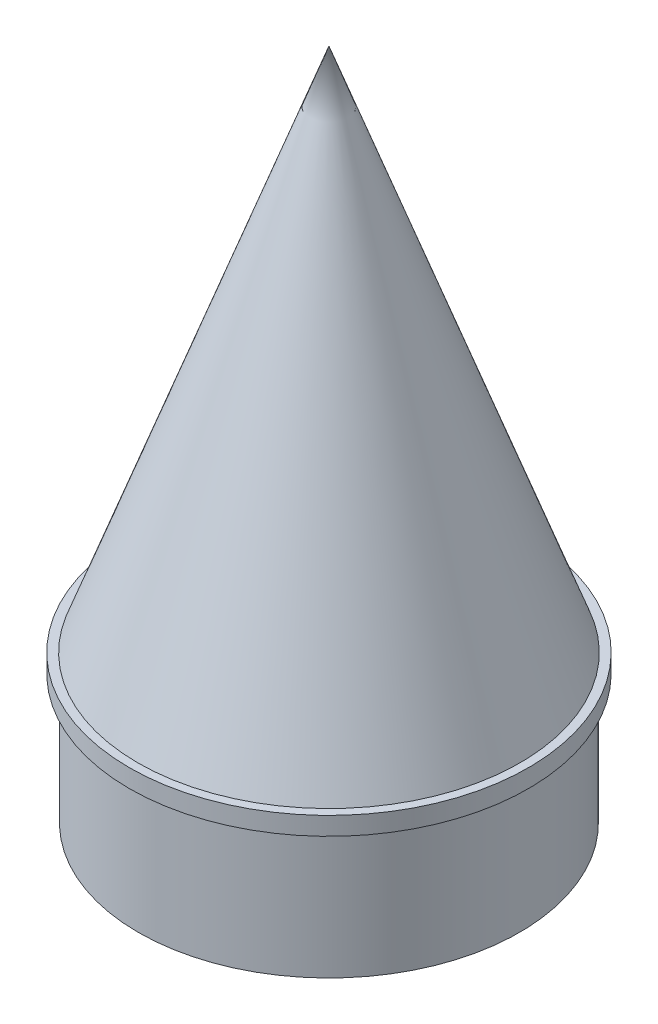
ISO-10303-21;
HEADER;
FILE_DESCRIPTION(('STEP AP214'),'2;1');
FILE_NAME('part.step','',(''),(''),'','','');
FILE_SCHEMA(('AUTOMOTIVE_DESIGN { 1 0 10303 214 1 1 1 1 }'));
ENDSEC;
DATA;
#1=APPLICATION_CONTEXT('core data for automotive mechanical design processes');
#2=APPLICATION_PROTOCOL_DEFINITION('international standard','automotive_design',2000,#1);
#3=PRODUCT_CONTEXT('',#1,'mechanical');
#4=PRODUCT('Part','Part','',(#3));
#5=PRODUCT_RELATED_PRODUCT_CATEGORY('part','',(#4));
#6=PRODUCT_DEFINITION_FORMATION('','',#4);
#7=PRODUCT_DEFINITION_CONTEXT('part definition',#1,'design');
#8=PRODUCT_DEFINITION('design','',#6,#7);
#9=PRODUCT_DEFINITION_SHAPE('','',#8);
#10=(LENGTH_UNIT() NAMED_UNIT(*) SI_UNIT(.MILLI.,.METRE.));
#11=(NAMED_UNIT(*) PLANE_ANGLE_UNIT() SI_UNIT($,.RADIAN.));
#12=(NAMED_UNIT(*) SI_UNIT($,.STERADIAN.) SOLID_ANGLE_UNIT());
#13=UNCERTAINTY_MEASURE_WITH_UNIT(LENGTH_MEASURE(1.E-05),#10,'distance_accuracy_value','');
#14=(GEOMETRIC_REPRESENTATION_CONTEXT(3) GLOBAL_UNCERTAINTY_ASSIGNED_CONTEXT((#13)) GLOBAL_UNIT_ASSIGNED_CONTEXT((#10,
#11,#12)) REPRESENTATION_CONTEXT('',''));
#15=CARTESIAN_POINT('',(0.,0.,0.));
#16=DIRECTION('',(0.,0.,1.));
#17=DIRECTION('',(1.,0.,0.));
#18=AXIS2_PLACEMENT_3D('',#15,#16,#17);
#19=CARTESIAN_POINT('',(0.,0.,0.));
#20=DIRECTION('',(0.,1.,0.));
#21=DIRECTION('',(0.,0.,1.));
#22=AXIS2_PLACEMENT_3D('',#19,#20,#21);
#23=PLANE('',#22);
#24=CARTESIAN_POINT('',(0.,0.,0.));
#25=DIRECTION('',(0.,1.,0.));
#26=DIRECTION('',(0.,0.,1.));
#27=AXIS2_PLACEMENT_3D('',#24,#25,#26);
#28=CIRCLE('',#27,21.1201);
#29=CARTESIAN_POINT('',(0.,0.,21.1201));
#30=VERTEX_POINT('',#29);
#31=EDGE_CURVE('E46',#30,#30,#28,.F.);
#32=ORIENTED_EDGE('',*,*,#31,.T.);
#33=EDGE_LOOP('',(#32));
#34=FACE_BOUND('',#33,.T.);
#35=DIRECTION('',(0.,0.,-1.));
#36=VECTOR('',#35,1.);
#37=CARTESIAN_POINT('',(-5.25,0.,10.25));
#38=LINE('',#37,#36);
#39=CARTESIAN_POINT('',(-5.25,0.,13.25));
#40=VERTEX_POINT('',#39);
#41=CARTESIAN_POINT('',(-5.25,0.,10.25));
#42=VERTEX_POINT('',#41);
#43=EDGE_CURVE('E144',#40,#42,#38,.T.);
#44=ORIENTED_EDGE('',*,*,#43,.F.);
#45=DIRECTION('',(-1.,0.,0.));
#46=VECTOR('',#45,1.);
#47=CARTESIAN_POINT('',(-5.25,0.,13.25));
#48=LINE('',#47,#46);
#49=CARTESIAN_POINT('',(5.25,0.,13.25));
#50=VERTEX_POINT('',#49);
#51=EDGE_CURVE('E165',#50,#40,#48,.T.);
#52=ORIENTED_EDGE('',*,*,#51,.F.);
#53=DIRECTION('',(0.,0.,1.));
#54=VECTOR('',#53,1.);
#55=CARTESIAN_POINT('',(5.25,0.,13.25));
#56=LINE('',#55,#54);
#57=CARTESIAN_POINT('',(5.25,0.,10.25));
#58=VERTEX_POINT('',#57);
#59=EDGE_CURVE('E60',#58,#50,#56,.T.);
#60=ORIENTED_EDGE('',*,*,#59,.F.);
#61=DIRECTION('',(-1.,0.,0.));
#62=VECTOR('',#61,1.);
#63=CARTESIAN_POINT('',(5.25,0.,10.25));
#64=LINE('',#63,#62);
#65=CARTESIAN_POINT('',(16.25,0.,10.25));
#66=VERTEX_POINT('',#65);
#67=EDGE_CURVE('E239',#66,#58,#64,.T.);
#68=ORIENTED_EDGE('',*,*,#67,.F.);
#69=DIRECTION('',(0.,0.,1.));
#70=VECTOR('',#69,1.);
#71=CARTESIAN_POINT('',(16.25,0.,10.25));
#72=LINE('',#71,#70);
#73=CARTESIAN_POINT('',(16.25,0.,-10.25));
#74=VERTEX_POINT('',#73);
#75=EDGE_CURVE('E235',#74,#66,#72,.T.);
#76=ORIENTED_EDGE('',*,*,#75,.F.);
#77=DIRECTION('',(1.,0.,0.));
#78=VECTOR('',#77,1.);
#79=CARTESIAN_POINT('',(16.25,0.,-10.25));
#80=LINE('',#79,#78);
#81=CARTESIAN_POINT('',(5.25,0.,-10.25));
#82=VERTEX_POINT('',#81);
#83=EDGE_CURVE('E231',#82,#74,#80,.T.);
#84=ORIENTED_EDGE('',*,*,#83,.F.);
#85=DIRECTION('',(0.,0.,1.));
#86=VECTOR('',#85,1.);
#87=CARTESIAN_POINT('',(5.25,0.,-10.25));
#88=LINE('',#87,#86);
#89=CARTESIAN_POINT('',(5.25,0.,-13.25));
#90=VERTEX_POINT('',#89);
#91=EDGE_CURVE('E227',#90,#82,#88,.T.);
#92=ORIENTED_EDGE('',*,*,#91,.F.);
#93=DIRECTION('',(1.,0.,0.));
#94=VECTOR('',#93,1.);
#95=CARTESIAN_POINT('',(5.25,0.,-13.25));
#96=LINE('',#95,#94);
#97=CARTESIAN_POINT('',(-5.25,0.,-13.25));
#98=VERTEX_POINT('',#97);
#99=EDGE_CURVE('E223',#98,#90,#96,.T.);
#100=ORIENTED_EDGE('',*,*,#99,.F.);
#101=DIRECTION('',(0.,0.,-1.));
#102=VECTOR('',#101,1.);
#103=CARTESIAN_POINT('',(-5.25,0.,-13.25));
#104=LINE('',#103,#102);
#105=CARTESIAN_POINT('',(-5.25,0.,-10.25));
#106=VERTEX_POINT('',#105);
#107=EDGE_CURVE('E219',#106,#98,#104,.T.);
#108=ORIENTED_EDGE('',*,*,#107,.F.);
#109=DIRECTION('',(1.,0.,0.));
#110=VECTOR('',#109,1.);
#111=CARTESIAN_POINT('',(-5.25,0.,-10.25));
#112=LINE('',#111,#110);
#113=CARTESIAN_POINT('',(-16.25,0.,-10.25));
#114=VERTEX_POINT('',#113);
#115=EDGE_CURVE('E215',#114,#106,#112,.T.);
#116=ORIENTED_EDGE('',*,*,#115,.F.);
#117=DIRECTION('',(0.,0.,-1.));
#118=VECTOR('',#117,1.);
#119=CARTESIAN_POINT('',(-16.25,0.,-10.25));
#120=LINE('',#119,#118);
#121=CARTESIAN_POINT('',(-16.25,0.,10.25));
#122=VERTEX_POINT('',#121);
#123=EDGE_CURVE('E211',#122,#114,#120,.T.);
#124=ORIENTED_EDGE('',*,*,#123,.F.);
#125=DIRECTION('',(-1.,0.,0.));
#126=VECTOR('',#125,1.);
#127=CARTESIAN_POINT('',(-16.25,0.,10.25));
#128=LINE('',#127,#126);
#129=EDGE_CURVE('E208',#42,#122,#128,.T.);
#130=ORIENTED_EDGE('',*,*,#129,.F.);
#131=EDGE_LOOP('',(#44,#52,#60,#68,#76,#84,#92,#100,#108,#116,#124,#130));
#132=FACE_BOUND('',#131,.T.);
#133=ADVANCED_FACE('F42',(#34,#132),#23,.F.);
#134=CARTESIAN_POINT('',(0.,63.5368133879744,0.));
#135=DIRECTION('',(0.,1.,0.));
#136=DIRECTION('',(0.,0.,1.));
#137=AXIS2_PLACEMENT_3D('',#134,#135,#136);
#138=CYLINDRICAL_SURFACE('',#137,21.1201);
#139=CARTESIAN_POINT('',(0.,-15.,0.));
#140=DIRECTION('',(0.,1.,0.));
#141=DIRECTION('',(0.,0.,1.));
#142=AXIS2_PLACEMENT_3D('',#139,#140,#141);
#143=CIRCLE('',#142,21.1201);
#144=CARTESIAN_POINT('',(0.,-15.,21.1201));
#145=VERTEX_POINT('',#144);
#146=EDGE_CURVE('E285',#145,#145,#143,.T.);
#147=ORIENTED_EDGE('',*,*,#146,.F.);
#148=EDGE_LOOP('',(#147));
#149=FACE_BOUND('',#148,.T.);
#150=ORIENTED_EDGE('',*,*,#31,.F.);
#151=EDGE_LOOP('',(#150));
#152=FACE_BOUND('',#151,.T.);
#153=ADVANCED_FACE('F307',(#149,#152),#138,.F.);
#154=CARTESIAN_POINT('',(-22.1611,-15.,0.));
#155=DIRECTION('',(0.,-1.,0.));
#156=DIRECTION('',(0.,0.,-1.));
#157=AXIS2_PLACEMENT_3D('',#154,#155,#156);
#158=PLANE('',#157);
#159=ORIENTED_EDGE('',*,*,#146,.T.);
#160=EDGE_LOOP('',(#159));
#161=FACE_BOUND('',#160,.T.);
#162=CARTESIAN_POINT('',(0.,-15.,0.));
#163=DIRECTION('',(0.,1.,0.));
#164=DIRECTION('',(0.,0.,1.));
#165=AXIS2_PLACEMENT_3D('',#162,#163,#164);
#166=CIRCLE('',#165,22.1611);
#167=CARTESIAN_POINT('',(0.,-15.,22.1611));
#168=VERTEX_POINT('',#167);
#169=EDGE_CURVE('E281',#168,#168,#166,.T.);
#170=ORIENTED_EDGE('',*,*,#169,.F.);
#171=EDGE_LOOP('',(#170));
#172=FACE_BOUND('',#171,.T.);
#173=ADVANCED_FACE('F309',(#161,#172),#158,.T.);
#174=CARTESIAN_POINT('',(0.,63.5368133879744,0.));
#175=DIRECTION('',(0.,1.,0.));
#176=DIRECTION('',(0.,0.,1.));
#177=AXIS2_PLACEMENT_3D('',#174,#175,#176);
#178=CYLINDRICAL_SURFACE('',#177,22.1611);
#179=ORIENTED_EDGE('',*,*,#169,.T.);
#180=EDGE_LOOP('',(#179));
#181=FACE_BOUND('',#180,.T.);
#182=CARTESIAN_POINT('',(0.,0.,0.));
#183=DIRECTION('',(0.,1.,0.));
#184=DIRECTION('',(0.,0.,1.));
#185=AXIS2_PLACEMENT_3D('',#182,#183,#184);
#186=CIRCLE('',#185,22.1611);
#187=CARTESIAN_POINT('',(0.,0.,22.1611));
#188=VERTEX_POINT('',#187);
#189=EDGE_CURVE('E248',#188,#188,#186,.T.);
#190=ORIENTED_EDGE('',*,*,#189,.F.);
#191=EDGE_LOOP('',(#190));
#192=FACE_BOUND('',#191,.T.);
#193=ADVANCED_FACE('F316',(#181,#192),#178,.T.);
#194=ORIENTED_EDGE('',*,*,#189,.T.);
#195=EDGE_LOOP('',(#194));
#196=FACE_BOUND('',#195,.T.);
#197=CARTESIAN_POINT('',(0.,0.,0.));
#198=DIRECTION('',(0.,1.,0.));
#199=DIRECTION('',(0.,0.,1.));
#200=AXIS2_PLACEMENT_3D('',#197,#198,#199);
#201=CIRCLE('',#200,23.2021);
#202=CARTESIAN_POINT('',(0.,0.,23.2021));
#203=VERTEX_POINT('',#202);
#204=EDGE_CURVE('E293',#203,#203,#201,.T.);
#205=ORIENTED_EDGE('',*,*,#204,.F.);
#206=EDGE_LOOP('',(#205));
#207=FACE_BOUND('',#206,.T.);
#208=ADVANCED_FACE('F44',(#196,#207),#23,.F.);
#209=CARTESIAN_POINT('',(0.,63.5368133879744,0.));
#210=DIRECTION('',(0.,1.,0.));
#211=DIRECTION('',(0.,0.,1.));
#212=AXIS2_PLACEMENT_3D('',#209,#210,#211);
#213=CYLINDRICAL_SURFACE('',#212,23.2021);
#214=ORIENTED_EDGE('',*,*,#204,.T.);
#215=EDGE_LOOP('',(#214));
#216=FACE_BOUND('',#215,.T.);
#217=CARTESIAN_POINT('',(0.,2.1082,0.));
#218=DIRECTION('',(0.,1.,0.));
#219=DIRECTION('',(0.,0.,1.));
#220=AXIS2_PLACEMENT_3D('',#217,#218,#219);
#221=CIRCLE('',#220,23.2021);
#222=CARTESIAN_POINT('',(0.,2.1082,23.2021));
#223=VERTEX_POINT('',#222);
#224=EDGE_CURVE('E289',#223,#223,#221,.T.);
#225=ORIENTED_EDGE('',*,*,#224,.F.);
#226=EDGE_LOOP('',(#225));
#227=FACE_BOUND('',#226,.T.);
#228=ADVANCED_FACE('F326',(#216,#227),#213,.T.);
#229=CARTESIAN_POINT('',(-23.2021,2.1082,0.));
#230=DIRECTION('',(0.,1.,0.));
#231=DIRECTION('',(0.,0.,1.));
#232=AXIS2_PLACEMENT_3D('',#229,#230,#231);
#233=PLANE('',#232);
#234=CARTESIAN_POINT('',(0.,2.1082,0.));
#235=DIRECTION('',(0.,-1.,0.));
#236=DIRECTION('',(0.,0.,-1.));
#237=AXIS2_PLACEMENT_3D('',#234,#235,#236);
#238=CIRCLE('',#237,22.225);
#239=CARTESIAN_POINT('',(0.,2.1082,-22.225));
#240=VERTEX_POINT('',#239);
#241=EDGE_CURVE('E11',#240,#240,#238,.T.);
#242=ORIENTED_EDGE('',*,*,#241,.T.);
#243=EDGE_LOOP('',(#242));
#244=FACE_BOUND('',#243,.T.);
#245=ORIENTED_EDGE('',*,*,#224,.T.);
#246=EDGE_LOOP('',(#245));
#247=FACE_BOUND('',#246,.T.);
#248=ADVANCED_FACE('F322',(#244,#247),#233,.T.);
#249=CARTESIAN_POINT('',(0.,63.1708856473796,0.));
#250=DIRECTION('',(0.,-1.,0.));
#251=DIRECTION('',(0.,0.,-1.));
#252=AXIS2_PLACEMENT_3D('',#249,#250,#251);
#253=CONICAL_SURFACE('',#252,0.,0.349065850398862);
#254=ORIENTED_EDGE('',*,*,#241,.F.);
#255=EDGE_LOOP('',(#254));
#256=FACE_BOUND('',#255,.T.);
#257=CARTESIAN_POINT('',(0.,63.1708856473796,0.));
#258=VERTEX_POINT('',#257);
#259=VERTEX_LOOP('',#258);
#260=FACE_BOUND('',#259,.T.);
#261=ADVANCED_FACE('F325',(#256,#260),#253,.T.);
#262=CARTESIAN_POINT('',(-5.25,3.,10.25));
#263=DIRECTION('',(-1.,0.,0.));
#264=DIRECTION('',(0.,0.,1.));
#265=AXIS2_PLACEMENT_3D('',#262,#263,#264);
#266=PLANE('',#265);
#267=ORIENTED_EDGE('',*,*,#43,.T.);
#268=DIRECTION('',(0.,-1.,0.));
#269=VECTOR('',#268,1.);
#270=CARTESIAN_POINT('',(-5.25,3.,10.25));
#271=LINE('',#270,#269);
#272=CARTESIAN_POINT('',(-5.25,3.,10.25));
#273=VERTEX_POINT('',#272);
#274=EDGE_CURVE('E137',#273,#42,#271,.T.);
#275=ORIENTED_EDGE('',*,*,#274,.F.);
#276=DIRECTION('',(0.,0.,-1.));
#277=VECTOR('',#276,1.);
#278=CARTESIAN_POINT('',(-5.25,3.,10.25));
#279=LINE('',#278,#277);
#280=CARTESIAN_POINT('',(-5.25,3.,13.25));
#281=VERTEX_POINT('',#280);
#282=EDGE_CURVE('E141',#281,#273,#279,.T.);
#283=ORIENTED_EDGE('',*,*,#282,.F.);
#284=DIRECTION('',(0.,-1.,0.));
#285=VECTOR('',#284,1.);
#286=CARTESIAN_POINT('',(-5.25,3.,13.25));
#287=LINE('',#286,#285);
#288=EDGE_CURVE('E245',#281,#40,#287,.T.);
#289=ORIENTED_EDGE('',*,*,#288,.T.);
#290=EDGE_LOOP('',(#267,#275,#283,#289));
#291=FACE_BOUND('',#290,.T.);
#292=ADVANCED_FACE('F139',(#291),#266,.F.);
#293=CARTESIAN_POINT('',(-5.25,3.,13.25));
#294=DIRECTION('',(0.,0.,1.));
#295=DIRECTION('',(1.,0.,0.));
#296=AXIS2_PLACEMENT_3D('',#293,#294,#295);
#297=PLANE('',#296);
#298=ORIENTED_EDGE('',*,*,#51,.T.);
#299=ORIENTED_EDGE('',*,*,#288,.F.);
#300=DIRECTION('',(-1.,0.,0.));
#301=VECTOR('',#300,1.);
#302=CARTESIAN_POINT('',(-5.25,3.,13.25));
#303=LINE('',#302,#301);
#304=CARTESIAN_POINT('',(5.25,3.,13.25));
#305=VERTEX_POINT('',#304);
#306=EDGE_CURVE('E150',#305,#281,#303,.T.);
#307=ORIENTED_EDGE('',*,*,#306,.F.);
#308=DIRECTION('',(0.,-1.,0.));
#309=VECTOR('',#308,1.);
#310=CARTESIAN_POINT('',(5.25,3.,13.25));
#311=LINE('',#310,#309);
#312=EDGE_CURVE('E249',#305,#50,#311,.T.);
#313=ORIENTED_EDGE('',*,*,#312,.T.);
#314=EDGE_LOOP('',(#298,#299,#307,#313));
#315=FACE_BOUND('',#314,.T.);
#316=ADVANCED_FACE('F344',(#315),#297,.F.);
#317=CARTESIAN_POINT('',(5.25,3.,13.25));
#318=DIRECTION('',(1.,0.,0.));
#319=DIRECTION('',(0.,0.,-1.));
#320=AXIS2_PLACEMENT_3D('',#317,#318,#319);
#321=PLANE('',#320);
#322=ORIENTED_EDGE('',*,*,#59,.T.);
#323=ORIENTED_EDGE('',*,*,#312,.F.);
#324=DIRECTION('',(0.,0.,1.));
#325=VECTOR('',#324,1.);
#326=CARTESIAN_POINT('',(5.25,3.,13.25));
#327=LINE('',#326,#325);
#328=CARTESIAN_POINT('',(5.25,3.,10.25));
#329=VERTEX_POINT('',#328);
#330=EDGE_CURVE('E201',#329,#305,#327,.T.);
#331=ORIENTED_EDGE('',*,*,#330,.F.);
#332=DIRECTION('',(0.,-1.,0.));
#333=VECTOR('',#332,1.);
#334=CARTESIAN_POINT('',(5.25,3.,10.25));
#335=LINE('',#334,#333);
#336=EDGE_CURVE('E252',#329,#58,#335,.T.);
#337=ORIENTED_EDGE('',*,*,#336,.T.);
#338=EDGE_LOOP('',(#322,#323,#331,#337));
#339=FACE_BOUND('',#338,.T.);
#340=ADVANCED_FACE('F353',(#339),#321,.F.);
#341=CARTESIAN_POINT('',(5.25,3.,10.25));
#342=DIRECTION('',(0.,0.,1.));
#343=DIRECTION('',(1.,0.,0.));
#344=AXIS2_PLACEMENT_3D('',#341,#342,#343);
#345=PLANE('',#344);
#346=ORIENTED_EDGE('',*,*,#67,.T.);
#347=ORIENTED_EDGE('',*,*,#336,.F.);
#348=DIRECTION('',(-1.,0.,0.));
#349=VECTOR('',#348,1.);
#350=CARTESIAN_POINT('',(5.25,3.,10.25));
#351=LINE('',#350,#349);
#352=CARTESIAN_POINT('',(16.25,3.,10.25));
#353=VERTEX_POINT('',#352);
#354=EDGE_CURVE('E197',#353,#329,#351,.T.);
#355=ORIENTED_EDGE('',*,*,#354,.F.);
#356=DIRECTION('',(0.,-1.,0.));
#357=VECTOR('',#356,1.);
#358=CARTESIAN_POINT('',(16.25,3.,10.25));
#359=LINE('',#358,#357);
#360=EDGE_CURVE('E255',#353,#66,#359,.T.);
#361=ORIENTED_EDGE('',*,*,#360,.T.);
#362=EDGE_LOOP('',(#346,#347,#355,#361));
#363=FACE_BOUND('',#362,.T.);
#364=ADVANCED_FACE('F405',(#363),#345,.F.);
#365=CARTESIAN_POINT('',(16.25,3.,10.25));
#366=DIRECTION('',(1.,0.,0.));
#367=DIRECTION('',(0.,0.,-1.));
#368=AXIS2_PLACEMENT_3D('',#365,#366,#367);
#369=PLANE('',#368);
#370=ORIENTED_EDGE('',*,*,#75,.T.);
#371=ORIENTED_EDGE('',*,*,#360,.F.);
#372=DIRECTION('',(0.,0.,1.));
#373=VECTOR('',#372,1.);
#374=CARTESIAN_POINT('',(16.25,3.,10.25));
#375=LINE('',#374,#373);
#376=CARTESIAN_POINT('',(16.25,3.,-10.25));
#377=VERTEX_POINT('',#376);
#378=EDGE_CURVE('E193',#377,#353,#375,.T.);
#379=ORIENTED_EDGE('',*,*,#378,.F.);
#380=DIRECTION('',(0.,-1.,0.));
#381=VECTOR('',#380,1.);
#382=CARTESIAN_POINT('',(16.25,3.,-10.25));
#383=LINE('',#382,#381);
#384=EDGE_CURVE('E258',#377,#74,#383,.T.);
#385=ORIENTED_EDGE('',*,*,#384,.T.);
#386=EDGE_LOOP('',(#370,#371,#379,#385));
#387=FACE_BOUND('',#386,.T.);
#388=ADVANCED_FACE('F414',(#387),#369,.F.);
#389=CARTESIAN_POINT('',(16.25,3.,-10.25));
#390=DIRECTION('',(0.,0.,-1.));
#391=DIRECTION('',(-1.,0.,0.));
#392=AXIS2_PLACEMENT_3D('',#389,#390,#391);
#393=PLANE('',#392);
#394=ORIENTED_EDGE('',*,*,#83,.T.);
#395=ORIENTED_EDGE('',*,*,#384,.F.);
#396=DIRECTION('',(1.,0.,0.));
#397=VECTOR('',#396,1.);
#398=CARTESIAN_POINT('',(16.25,3.,-10.25));
#399=LINE('',#398,#397);
#400=CARTESIAN_POINT('',(5.25,3.,-10.25));
#401=VERTEX_POINT('',#400);
#402=EDGE_CURVE('E189',#401,#377,#399,.T.);
#403=ORIENTED_EDGE('',*,*,#402,.F.);
#404=DIRECTION('',(0.,-1.,0.));
#405=VECTOR('',#404,1.);
#406=CARTESIAN_POINT('',(5.25,3.,-10.25));
#407=LINE('',#406,#405);
#408=EDGE_CURVE('E261',#401,#82,#407,.T.);
#409=ORIENTED_EDGE('',*,*,#408,.T.);
#410=EDGE_LOOP('',(#394,#395,#403,#409));
#411=FACE_BOUND('',#410,.T.);
#412=ADVANCED_FACE('F424',(#411),#393,.F.);
#413=CARTESIAN_POINT('',(5.25,3.,-10.25));
#414=DIRECTION('',(1.,0.,0.));
#415=DIRECTION('',(0.,0.,-1.));
#416=AXIS2_PLACEMENT_3D('',#413,#414,#415);
#417=PLANE('',#416);
#418=ORIENTED_EDGE('',*,*,#91,.T.);
#419=ORIENTED_EDGE('',*,*,#408,.F.);
#420=DIRECTION('',(0.,0.,1.));
#421=VECTOR('',#420,1.);
#422=CARTESIAN_POINT('',(5.25,3.,-10.25));
#423=LINE('',#422,#421);
#424=CARTESIAN_POINT('',(5.25,3.,-13.25));
#425=VERTEX_POINT('',#424);
#426=EDGE_CURVE('E185',#425,#401,#423,.T.);
#427=ORIENTED_EDGE('',*,*,#426,.F.);
#428=DIRECTION('',(0.,-1.,0.));
#429=VECTOR('',#428,1.);
#430=CARTESIAN_POINT('',(5.25,3.,-13.25));
#431=LINE('',#430,#429);
#432=EDGE_CURVE('E264',#425,#90,#431,.T.);
#433=ORIENTED_EDGE('',*,*,#432,.T.);
#434=EDGE_LOOP('',(#418,#419,#427,#433));
#435=FACE_BOUND('',#434,.T.);
#436=ADVANCED_FACE('F434',(#435),#417,.F.);
#437=CARTESIAN_POINT('',(5.25,3.,-13.25));
#438=DIRECTION('',(0.,0.,-1.));
#439=DIRECTION('',(-1.,0.,0.));
#440=AXIS2_PLACEMENT_3D('',#437,#438,#439);
#441=PLANE('',#440);
#442=ORIENTED_EDGE('',*,*,#99,.T.);
#443=ORIENTED_EDGE('',*,*,#432,.F.);
#444=DIRECTION('',(1.,0.,0.));
#445=VECTOR('',#444,1.);
#446=CARTESIAN_POINT('',(5.25,3.,-13.25));
#447=LINE('',#446,#445);
#448=CARTESIAN_POINT('',(-5.25,3.,-13.25));
#449=VERTEX_POINT('',#448);
#450=EDGE_CURVE('E181',#449,#425,#447,.T.);
#451=ORIENTED_EDGE('',*,*,#450,.F.);
#452=DIRECTION('',(0.,-1.,0.));
#453=VECTOR('',#452,1.);
#454=CARTESIAN_POINT('',(-5.25,3.,-13.25));
#455=LINE('',#454,#453);
#456=EDGE_CURVE('E267',#449,#98,#455,.T.);
#457=ORIENTED_EDGE('',*,*,#456,.T.);
#458=EDGE_LOOP('',(#442,#443,#451,#457));
#459=FACE_BOUND('',#458,.T.);
#460=ADVANCED_FACE('F444',(#459),#441,.F.);
#461=CARTESIAN_POINT('',(-5.25,3.,-13.25));
#462=DIRECTION('',(-1.,0.,0.));
#463=DIRECTION('',(0.,0.,1.));
#464=AXIS2_PLACEMENT_3D('',#461,#462,#463);
#465=PLANE('',#464);
#466=ORIENTED_EDGE('',*,*,#107,.T.);
#467=ORIENTED_EDGE('',*,*,#456,.F.);
#468=DIRECTION('',(0.,0.,-1.));
#469=VECTOR('',#468,1.);
#470=CARTESIAN_POINT('',(-5.25,3.,-13.25));
#471=LINE('',#470,#469);
#472=CARTESIAN_POINT('',(-5.25,3.,-10.25));
#473=VERTEX_POINT('',#472);
#474=EDGE_CURVE('E177',#473,#449,#471,.T.);
#475=ORIENTED_EDGE('',*,*,#474,.F.);
#476=DIRECTION('',(0.,-1.,0.));
#477=VECTOR('',#476,1.);
#478=CARTESIAN_POINT('',(-5.25,3.,-10.25));
#479=LINE('',#478,#477);
#480=EDGE_CURVE('E270',#473,#106,#479,.T.);
#481=ORIENTED_EDGE('',*,*,#480,.T.);
#482=EDGE_LOOP('',(#466,#467,#475,#481));
#483=FACE_BOUND('',#482,.T.);
#484=ADVANCED_FACE('F454',(#483),#465,.F.);
#485=CARTESIAN_POINT('',(-5.25,3.,-10.25));
#486=DIRECTION('',(0.,0.,-1.));
#487=DIRECTION('',(-1.,0.,0.));
#488=AXIS2_PLACEMENT_3D('',#485,#486,#487);
#489=PLANE('',#488);
#490=ORIENTED_EDGE('',*,*,#115,.T.);
#491=ORIENTED_EDGE('',*,*,#480,.F.);
#492=DIRECTION('',(1.,0.,0.));
#493=VECTOR('',#492,1.);
#494=CARTESIAN_POINT('',(-5.25,3.,-10.25));
#495=LINE('',#494,#493);
#496=CARTESIAN_POINT('',(-16.25,3.,-10.25));
#497=VERTEX_POINT('',#496);
#498=EDGE_CURVE('E173',#497,#473,#495,.T.);
#499=ORIENTED_EDGE('',*,*,#498,.F.);
#500=DIRECTION('',(0.,-1.,0.));
#501=VECTOR('',#500,1.);
#502=CARTESIAN_POINT('',(-16.25,3.,-10.25));
#503=LINE('',#502,#501);
#504=EDGE_CURVE('E273',#497,#114,#503,.T.);
#505=ORIENTED_EDGE('',*,*,#504,.T.);
#506=EDGE_LOOP('',(#490,#491,#499,#505));
#507=FACE_BOUND('',#506,.T.);
#508=ADVANCED_FACE('F464',(#507),#489,.F.);
#509=CARTESIAN_POINT('',(-16.25,3.,-10.25));
#510=DIRECTION('',(-1.,0.,0.));
#511=DIRECTION('',(0.,0.,1.));
#512=AXIS2_PLACEMENT_3D('',#509,#510,#511);
#513=PLANE('',#512);
#514=ORIENTED_EDGE('',*,*,#123,.T.);
#515=ORIENTED_EDGE('',*,*,#504,.F.);
#516=DIRECTION('',(0.,0.,-1.));
#517=VECTOR('',#516,1.);
#518=CARTESIAN_POINT('',(-16.25,3.,-10.25));
#519=LINE('',#518,#517);
#520=CARTESIAN_POINT('',(-16.25,3.,10.25));
#521=VERTEX_POINT('',#520);
#522=EDGE_CURVE('E159',#521,#497,#519,.T.);
#523=ORIENTED_EDGE('',*,*,#522,.F.);
#524=DIRECTION('',(0.,-1.,0.));
#525=VECTOR('',#524,1.);
#526=CARTESIAN_POINT('',(-16.25,3.,10.25));
#527=LINE('',#526,#525);
#528=EDGE_CURVE('E149',#521,#122,#527,.T.);
#529=ORIENTED_EDGE('',*,*,#528,.T.);
#530=EDGE_LOOP('',(#514,#515,#523,#529));
#531=FACE_BOUND('',#530,.T.);
#532=ADVANCED_FACE('F474',(#531),#513,.F.);
#533=CARTESIAN_POINT('',(-16.25,3.,10.25));
#534=DIRECTION('',(0.,0.,1.));
#535=DIRECTION('',(1.,0.,0.));
#536=AXIS2_PLACEMENT_3D('',#533,#534,#535);
#537=PLANE('',#536);
#538=ORIENTED_EDGE('',*,*,#129,.T.);
#539=ORIENTED_EDGE('',*,*,#528,.F.);
#540=DIRECTION('',(-1.,0.,0.));
#541=VECTOR('',#540,1.);
#542=CARTESIAN_POINT('',(-16.25,3.,10.25));
#543=LINE('',#542,#541);
#544=EDGE_CURVE('E153',#273,#521,#543,.T.);
#545=ORIENTED_EDGE('',*,*,#544,.F.);
#546=ORIENTED_EDGE('',*,*,#274,.T.);
#547=EDGE_LOOP('',(#538,#539,#545,#546));
#548=FACE_BOUND('',#547,.T.);
#549=ADVANCED_FACE('F154',(#548),#537,.F.);
#550=CARTESIAN_POINT('',(0.,3.,0.));
#551=DIRECTION('',(0.,1.,0.));
#552=DIRECTION('',(0.,0.,1.));
#553=AXIS2_PLACEMENT_3D('',#550,#551,#552);
#554=PLANE('',#553);
#555=ORIENTED_EDGE('',*,*,#282,.T.);
#556=ORIENTED_EDGE('',*,*,#544,.T.);
#557=ORIENTED_EDGE('',*,*,#522,.T.);
#558=ORIENTED_EDGE('',*,*,#498,.T.);
#559=ORIENTED_EDGE('',*,*,#474,.T.);
#560=ORIENTED_EDGE('',*,*,#450,.T.);
#561=ORIENTED_EDGE('',*,*,#426,.T.);
#562=ORIENTED_EDGE('',*,*,#402,.T.);
#563=ORIENTED_EDGE('',*,*,#378,.T.);
#564=ORIENTED_EDGE('',*,*,#354,.T.);
#565=ORIENTED_EDGE('',*,*,#330,.T.);
#566=ORIENTED_EDGE('',*,*,#306,.T.);
#567=EDGE_LOOP('',(#555,#556,#557,#558,#559,#560,#561,#562,#563,#564,#565,#566));
#568=FACE_BOUND('',#567,.T.);
#569=ADVANCED_FACE('F161',(#568),#554,.F.);
#570=CLOSED_SHELL('',(#133,#153,#173,#193,#208,#228,#248,#261,#292,#316,#340,#364,#388,#412,
#436,#460,#484,#508,#532,#549,#569));
#571=CARTESIAN_POINT('',(0.,5.,0.));
#572=DIRECTION('',(0.,-1.,0.));
#573=DIRECTION('',(0.,0.,-1.));
#574=AXIS2_PLACEMENT_3D('',#571,#572,#573);
#575=CONICAL_SURFACE('',#574,20.0646618154016,0.349065850398863);
#576=CARTESIAN_POINT('',(0.,60.1272052668098,0.));
#577=VERTEX_POINT('',#576);
#578=VERTEX_LOOP('',#577);
#579=FACE_BOUND('',#578,.T.);
#580=CARTESIAN_POINT('',(0.,5.,0.));
#581=DIRECTION('',(0.,-1.,0.));
#582=DIRECTION('',(0.,0.,-1.));
#583=AXIS2_PLACEMENT_3D('',#580,#581,#582);
#584=CIRCLE('',#583,20.0646618154016);
#585=CARTESIAN_POINT('',(0.,5.,-20.0646618154016));
#586=VERTEX_POINT('',#585);
#587=EDGE_CURVE('E53',#586,#586,#584,.T.);
#588=ORIENTED_EDGE('',*,*,#587,.T.);
#589=EDGE_LOOP('',(#588));
#590=FACE_BOUND('',#589,.T.);
#591=ADVANCED_FACE('F334',(#579,#590),#575,.F.);
#592=CARTESIAN_POINT('',(20.0646618154016,5.,1.40110784597346E-13));
#593=DIRECTION('',(0.,-1.,0.));
#594=DIRECTION('',(0.,0.,-1.));
#595=AXIS2_PLACEMENT_3D('',#592,#593,#594);
#596=PLANE('',#595);
#597=ORIENTED_EDGE('',*,*,#587,.F.);
#598=EDGE_LOOP('',(#597));
#599=FACE_BOUND('',#598,.T.);
#600=ADVANCED_FACE('F331',(#599),#596,.F.);
#601=CLOSED_SHELL('',(#591,#600));
#602=ORIENTED_CLOSED_SHELL('',*,#601,.T.);
#603=BREP_WITH_VOIDS('B2',#570,(#602));
#604=ADVANCED_BREP_SHAPE_REPRESENTATION('',(#18,#603),#14);
#605=SHAPE_DEFINITION_REPRESENTATION(#9,#604);
ENDSEC;
END-ISO-10303-21;
